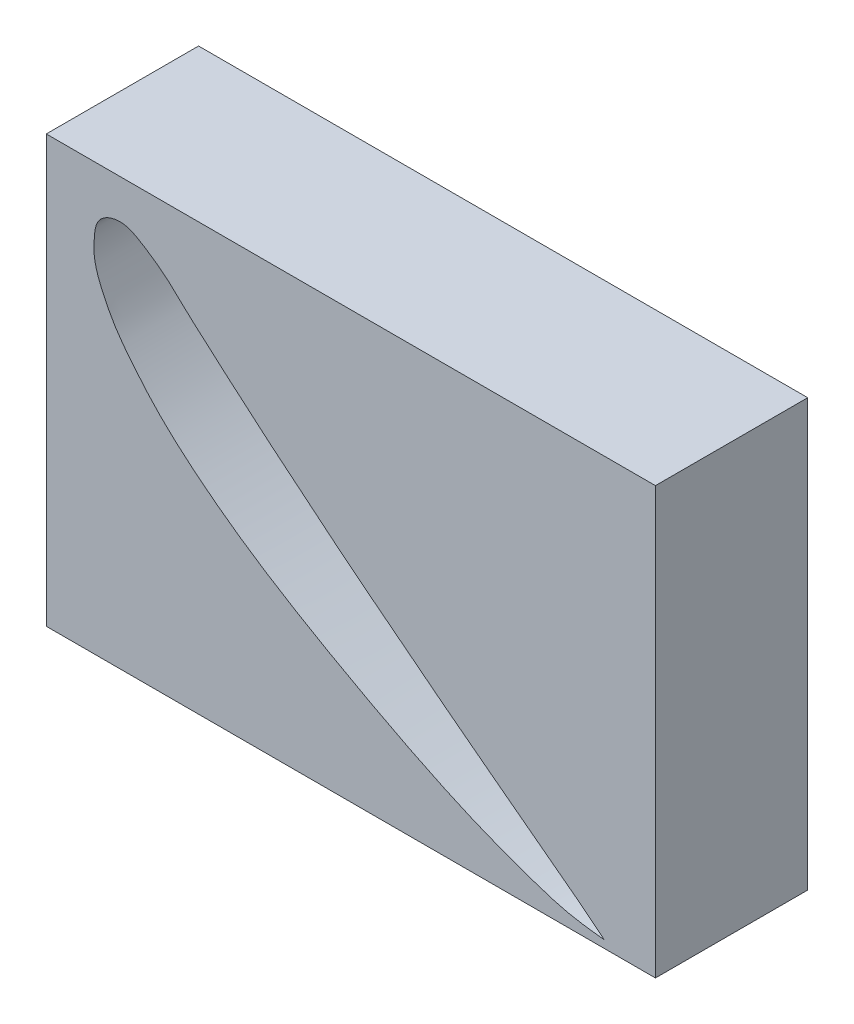
ISO-10303-21;
HEADER;
FILE_DESCRIPTION(('STEP AP214'),'2;1');
FILE_NAME('part.step','',(''),(''),'','','');
FILE_SCHEMA(('AUTOMOTIVE_DESIGN { 1 0 10303 214 1 1 1 1 }'));
ENDSEC;
DATA;
#1=APPLICATION_CONTEXT('core data for automotive mechanical design processes');
#2=APPLICATION_PROTOCOL_DEFINITION('international standard','automotive_design',2000,#1);
#3=PRODUCT_CONTEXT('',#1,'mechanical');
#4=PRODUCT('Part','Part','',(#3));
#5=PRODUCT_RELATED_PRODUCT_CATEGORY('part','',(#4));
#6=PRODUCT_DEFINITION_FORMATION('','',#4);
#7=PRODUCT_DEFINITION_CONTEXT('part definition',#1,'design');
#8=PRODUCT_DEFINITION('design','',#6,#7);
#9=PRODUCT_DEFINITION_SHAPE('','',#8);
#10=(LENGTH_UNIT() NAMED_UNIT(*) SI_UNIT(.MILLI.,.METRE.));
#11=(NAMED_UNIT(*) PLANE_ANGLE_UNIT() SI_UNIT($,.RADIAN.));
#12=(NAMED_UNIT(*) SI_UNIT($,.STERADIAN.) SOLID_ANGLE_UNIT());
#13=UNCERTAINTY_MEASURE_WITH_UNIT(LENGTH_MEASURE(1.E-05),#10,'distance_accuracy_value','');
#14=(GEOMETRIC_REPRESENTATION_CONTEXT(3) GLOBAL_UNCERTAINTY_ASSIGNED_CONTEXT((#13)) GLOBAL_UNIT_ASSIGNED_CONTEXT((#10,
#11,#12)) REPRESENTATION_CONTEXT('',''));
#15=CARTESIAN_POINT('',(0.,0.,0.));
#16=DIRECTION('',(0.,0.,1.));
#17=DIRECTION('',(1.,0.,0.));
#18=AXIS2_PLACEMENT_3D('',#15,#16,#17);
#19=CARTESIAN_POINT('',(-30.,30.,122.065556157337));
#20=DIRECTION('',(1.,0.,0.));
#21=DIRECTION('',(0.,1.,0.));
#22=AXIS2_PLACEMENT_3D('',#19,#20,#21);
#23=PLANE('',#22);
#24=DIRECTION('',(0.,-1.,0.));
#25=VECTOR('',#24,1.);
#26=CARTESIAN_POINT('',(-30.,30.,0.));
#27=LINE('',#26,#25);
#28=CARTESIAN_POINT('',(-30.,30.,0.));
#29=VERTEX_POINT('',#28);
#30=CARTESIAN_POINT('',(-30.,-40.,0.));
#31=VERTEX_POINT('',#30);
#32=EDGE_CURVE('E133',#29,#31,#27,.T.);
#33=ORIENTED_EDGE('',*,*,#32,.F.);
#34=DIRECTION('',(0.,0.,-1.));
#35=VECTOR('',#34,1.);
#36=CARTESIAN_POINT('',(-30.,30.,122.065556157337));
#37=LINE('',#36,#35);
#38=CARTESIAN_POINT('',(-30.,30.,-25.));
#39=VERTEX_POINT('',#38);
#40=EDGE_CURVE('E37',#29,#39,#37,.T.);
#41=ORIENTED_EDGE('',*,*,#40,.T.);
#42=DIRECTION('',(0.,-1.,0.));
#43=VECTOR('',#42,1.);
#44=CARTESIAN_POINT('',(-30.,30.,-25.));
#45=LINE('',#44,#43);
#46=CARTESIAN_POINT('',(-30.,-40.,-25.));
#47=VERTEX_POINT('',#46);
#48=EDGE_CURVE('E151',#39,#47,#45,.T.);
#49=ORIENTED_EDGE('',*,*,#48,.T.);
#50=DIRECTION('',(0.,0.,-1.));
#51=VECTOR('',#50,1.);
#52=CARTESIAN_POINT('',(-30.,-40.,122.065556157337));
#53=LINE('',#52,#51);
#54=EDGE_CURVE('E137',#31,#47,#53,.T.);
#55=ORIENTED_EDGE('',*,*,#54,.F.);
#56=EDGE_LOOP('',(#33,#41,#49,#55));
#57=FACE_BOUND('',#56,.T.);
#58=ADVANCED_FACE('F33',(#57),#23,.F.);
#59=CARTESIAN_POINT('',(-30.,-40.,122.065556157337));
#60=DIRECTION('',(0.,1.,0.));
#61=DIRECTION('',(0.,0.,1.));
#62=AXIS2_PLACEMENT_3D('',#59,#60,#61);
#63=PLANE('',#62);
#64=DIRECTION('',(1.,0.,0.));
#65=VECTOR('',#64,1.);
#66=CARTESIAN_POINT('',(-30.,-40.,0.));
#67=LINE('',#66,#65);
#68=CARTESIAN_POINT('',(70.,-40.,0.));
#69=VERTEX_POINT('',#68);
#70=EDGE_CURVE('E42',#31,#69,#67,.T.);
#71=ORIENTED_EDGE('',*,*,#70,.F.);
#72=ORIENTED_EDGE('',*,*,#54,.T.);
#73=DIRECTION('',(1.,0.,0.));
#74=VECTOR('',#73,1.);
#75=CARTESIAN_POINT('',(-30.,-40.,-25.));
#76=LINE('',#75,#74);
#77=CARTESIAN_POINT('',(70.,-40.,-25.));
#78=VERTEX_POINT('',#77);
#79=EDGE_CURVE('E150',#47,#78,#76,.T.);
#80=ORIENTED_EDGE('',*,*,#79,.T.);
#81=DIRECTION('',(0.,0.,-1.));
#82=VECTOR('',#81,1.);
#83=CARTESIAN_POINT('',(70.,-40.,122.065556157337));
#84=LINE('',#83,#82);
#85=EDGE_CURVE('E152',#69,#78,#84,.T.);
#86=ORIENTED_EDGE('',*,*,#85,.F.);
#87=EDGE_LOOP('',(#71,#72,#80,#86));
#88=FACE_BOUND('',#87,.T.);
#89=ADVANCED_FACE('F122',(#88),#63,.F.);
#90=CARTESIAN_POINT('',(70.,30.,122.065556157337));
#91=DIRECTION('',(-1.,0.,0.));
#92=DIRECTION('',(0.,-1.,0.));
#93=AXIS2_PLACEMENT_3D('',#90,#91,#92);
#94=PLANE('',#93);
#95=DIRECTION('',(0.,1.,0.));
#96=VECTOR('',#95,1.);
#97=CARTESIAN_POINT('',(70.,30.,0.));
#98=LINE('',#97,#96);
#99=CARTESIAN_POINT('',(70.,30.,0.));
#100=VERTEX_POINT('',#99);
#101=EDGE_CURVE('E11',#69,#100,#98,.T.);
#102=ORIENTED_EDGE('',*,*,#101,.F.);
#103=ORIENTED_EDGE('',*,*,#85,.T.);
#104=DIRECTION('',(0.,1.,0.));
#105=VECTOR('',#104,1.);
#106=CARTESIAN_POINT('',(70.,30.,-25.));
#107=LINE('',#106,#105);
#108=CARTESIAN_POINT('',(70.,30.,-25.));
#109=VERTEX_POINT('',#108);
#110=EDGE_CURVE('E153',#78,#109,#107,.T.);
#111=ORIENTED_EDGE('',*,*,#110,.T.);
#112=DIRECTION('',(0.,0.,-1.));
#113=VECTOR('',#112,1.);
#114=CARTESIAN_POINT('',(70.,30.,122.065556157337));
#115=LINE('',#114,#113);
#116=EDGE_CURVE('E145',#100,#109,#115,.T.);
#117=ORIENTED_EDGE('',*,*,#116,.F.);
#118=EDGE_LOOP('',(#102,#103,#111,#117));
#119=FACE_BOUND('',#118,.T.);
#120=ADVANCED_FACE('F118',(#119),#94,.F.);
#121=CARTESIAN_POINT('',(-30.,30.,122.065556157337));
#122=DIRECTION('',(0.,-1.,0.));
#123=DIRECTION('',(0.,0.,-1.));
#124=AXIS2_PLACEMENT_3D('',#121,#122,#123);
#125=PLANE('',#124);
#126=DIRECTION('',(-1.,0.,0.));
#127=VECTOR('',#126,1.);
#128=CARTESIAN_POINT('',(-30.,30.,0.));
#129=LINE('',#128,#127);
#130=EDGE_CURVE('E140',#100,#29,#129,.T.);
#131=ORIENTED_EDGE('',*,*,#130,.F.);
#132=ORIENTED_EDGE('',*,*,#116,.T.);
#133=DIRECTION('',(-1.,0.,0.));
#134=VECTOR('',#133,1.);
#135=CARTESIAN_POINT('',(-30.,30.,-25.));
#136=LINE('',#135,#134);
#137=EDGE_CURVE('E143',#109,#39,#136,.T.);
#138=ORIENTED_EDGE('',*,*,#137,.T.);
#139=ORIENTED_EDGE('',*,*,#40,.F.);
#140=EDGE_LOOP('',(#131,#132,#138,#139));
#141=FACE_BOUND('',#140,.T.);
#142=ADVANCED_FACE('F115',(#141),#125,.F.);
#143=CARTESIAN_POINT('',(0.,0.,-25.));
#144=DIRECTION('',(0.,0.,1.));
#145=DIRECTION('',(1.,0.,0.));
#146=AXIS2_PLACEMENT_3D('',#143,#144,#145);
#147=PLANE('',#146);
#148=DIRECTION('',(-0.778272578096171,0.627926583434353,0.));
#149=VECTOR('',#148,1.);
#150=CARTESIAN_POINT('',(57.6036750056897,-35.542429998651,-25.));
#151=LINE('',#150,#149);
#152=CARTESIAN_POINT('',(61.6010045224295,-38.7675590047992,-25.));
#153=VERTEX_POINT('',#152);
#154=CARTESIAN_POINT('',(57.6036750056897,-35.542429998651,-25.));
#155=VERTEX_POINT('',#154);
#156=EDGE_CURVE('E91',#153,#155,#151,.T.);
#157=ORIENTED_EDGE('',*,*,#156,.T.);
#158=CARTESIAN_POINT('',(57.6036750056897,-35.542429998651,-25.));
#159=CARTESIAN_POINT('',(56.2388977920127,-34.5074688290924,-25.));
#160=CARTESIAN_POINT('',(52.1445661509825,-31.4025853204187,-25.));
#161=CARTESIAN_POINT('',(45.3307585008602,-26.2147388286433,-25.));
#162=CARTESIAN_POINT('',(37.1067324226143,-20.0526071035048,-25.));
#163=CARTESIAN_POINT('',(29.0609366160996,-13.6617388149896,-25.));
#164=CARTESIAN_POINT('',(20.9169067344713,-7.39798040461272,-25.));
#165=CARTESIAN_POINT('',(12.9930323521428,-0.858716209414723,-25.));
#166=CARTESIAN_POINT('',(5.0582858099475,5.67038609166147,-25.));
#167=CARTESIAN_POINT('',(-1.37994875889341,11.3186071088783,-25.));
#168=CARTESIAN_POINT('',(-6.55409176600592,15.8203851997197,-25.));
#169=CARTESIAN_POINT('',(-9.57237805067181,18.8722758003235,-25.));
#170=CARTESIAN_POINT('',(-12.298789195959,20.976651583068,-25.));
#171=CARTESIAN_POINT('',(-14.4635519547526,22.3926177272927,-25.));
#172=CARTESIAN_POINT('',(-16.510186542221,23.5174604617983,-25.));
#173=CARTESIAN_POINT('',(-19.0350807988717,23.665473590377,-25.));
#174=CARTESIAN_POINT('',(-21.8604448995324,22.33963517474,-25.));
#175=CARTESIAN_POINT('',(-22.1349100172756,19.2815932305263,-25.));
#176=CARTESIAN_POINT('',(-22.2371773427754,16.5185153432735,-25.));
#177=CARTESIAN_POINT('',(-21.5273338612396,13.8353548334428,-25.));
#178=CARTESIAN_POINT('',(-20.2845397207269,11.1357407607872,-25.));
#179=CARTESIAN_POINT('',(-18.5798651776483,7.87909576155419,-25.));
#180=CARTESIAN_POINT('',(-15.8508439766193,4.35202984587507,-25.));
#181=CARTESIAN_POINT('',(-11.3474147710772,-0.934034012882321,-25.));
#182=CARTESIAN_POINT('',(-4.87029553469975,-6.64452599687584,-25.));
#183=CARTESIAN_POINT('',(3.4491751156533,-12.737304018546,-25.));
#184=CARTESIAN_POINT('',(12.2629555051353,-18.1725092001077,-25.));
#185=CARTESIAN_POINT('',(21.3285981876965,-23.2930852361814,-25.));
#186=CARTESIAN_POINT('',(30.6182219615916,-28.1713689973377,-25.));
#187=CARTESIAN_POINT('',(40.2405490728829,-32.7082606263667,-25.));
#188=CARTESIAN_POINT('',(48.6640657815466,-35.853082063981,-25.));
#189=CARTESIAN_POINT('',(55.790549096225,-38.1108965549288,-25.));
#190=CARTESIAN_POINT('',(59.6208137108184,-38.5437698429893,-25.));
#191=CARTESIAN_POINT('',(61.6010045224295,-38.7675590047992,-25.));
#192=B_SPLINE_CURVE_WITH_KNOTS('',3,(#158,#159,#160,#161,#162,#163,#164,#165,#166,#167,#168,
#169,#170,#171,#172,#173,#174,#175,#176,#177,#178,#179,#180,#181,#182,#183,#184,#185,#186,#187,
#188,#189,#190,#191),.UNSPECIFIED.,.F.,.F.,(4,1,1,1,1,1,1,1,1,1,1,1,1,1,1,1,1,1,1,1,1,1,1,1,1,1,
1,1,1,1,1,4),(0.,0.024539223239315,0.0736176697179449,0.122696116196575,0.171758102468826,
0.220820088741077,0.269879113320182,0.318936693489756,0.368025361597795,0.392583028094628,
0.417173001250673,0.429440472758663,0.441764658743505,0.454461371263475,0.461994015532278,
0.477712656864197,0.492780517083889,0.502278122505289,0.517831839222446,0.531656069899839,
0.544957030128068,0.57036121074101,0.595284183630096,0.644429948946362,0.693535769444944,
0.742943262592495,0.792666042354747,0.842690657547491,0.893260265870848,0.94491578158227,
0.971522264346957,1.),.UNSPECIFIED.);
#193=EDGE_CURVE('E50',#155,#153,#192,.T.);
#194=ORIENTED_EDGE('',*,*,#193,.T.);
#195=EDGE_LOOP('',(#157,#194));
#196=FACE_BOUND('',#195,.T.);
#197=ORIENTED_EDGE('',*,*,#48,.F.);
#198=ORIENTED_EDGE('',*,*,#137,.F.);
#199=ORIENTED_EDGE('',*,*,#110,.F.);
#200=ORIENTED_EDGE('',*,*,#79,.F.);
#201=EDGE_LOOP('',(#197,#198,#199,#200));
#202=FACE_BOUND('',#201,.T.);
#203=ADVANCED_FACE('F97',(#196,#202),#147,.F.);
#204=CARTESIAN_POINT('',(0.,0.,0.));
#205=DIRECTION('',(0.,0.,1.));
#206=DIRECTION('',(1.,0.,0.));
#207=AXIS2_PLACEMENT_3D('',#204,#205,#206);
#208=PLANE('',#207);
#209=CARTESIAN_POINT('',(57.6036750056897,-35.542429998651,0.));
#210=CARTESIAN_POINT('',(56.2388977920127,-34.5074688290924,0.));
#211=CARTESIAN_POINT('',(52.1445661509825,-31.4025853204187,0.));
#212=CARTESIAN_POINT('',(45.3307585008602,-26.2147388286433,0.));
#213=CARTESIAN_POINT('',(37.1067324226143,-20.0526071035048,0.));
#214=CARTESIAN_POINT('',(29.0609366160996,-13.6617388149896,0.));
#215=CARTESIAN_POINT('',(20.9169067344713,-7.39798040461272,0.));
#216=CARTESIAN_POINT('',(12.9930323521428,-0.858716209414723,0.));
#217=CARTESIAN_POINT('',(5.0582858099475,5.67038609166147,0.));
#218=CARTESIAN_POINT('',(-1.37994875889341,11.3186071088783,0.));
#219=CARTESIAN_POINT('',(-6.55409176600592,15.8203851997197,0.));
#220=CARTESIAN_POINT('',(-9.57237805067181,18.8722758003235,0.));
#221=CARTESIAN_POINT('',(-12.298789195959,20.976651583068,0.));
#222=CARTESIAN_POINT('',(-14.4635519547526,22.3926177272927,0.));
#223=CARTESIAN_POINT('',(-16.510186542221,23.5174604617983,0.));
#224=CARTESIAN_POINT('',(-19.0350807988717,23.665473590377,0.));
#225=CARTESIAN_POINT('',(-21.8604448995324,22.33963517474,0.));
#226=CARTESIAN_POINT('',(-22.1349100172756,19.2815932305263,0.));
#227=CARTESIAN_POINT('',(-22.2371773427754,16.5185153432735,0.));
#228=CARTESIAN_POINT('',(-21.5273338612396,13.8353548334428,0.));
#229=CARTESIAN_POINT('',(-20.2845397207269,11.1357407607872,0.));
#230=CARTESIAN_POINT('',(-18.5798651776483,7.87909576155419,0.));
#231=CARTESIAN_POINT('',(-15.8508439766193,4.35202984587507,0.));
#232=CARTESIAN_POINT('',(-11.3474147710772,-0.934034012882321,0.));
#233=CARTESIAN_POINT('',(-4.87029553469975,-6.64452599687584,0.));
#234=CARTESIAN_POINT('',(3.4491751156533,-12.737304018546,0.));
#235=CARTESIAN_POINT('',(12.2629555051353,-18.1725092001077,0.));
#236=CARTESIAN_POINT('',(21.3285981876965,-23.2930852361814,0.));
#237=CARTESIAN_POINT('',(30.6182219615916,-28.1713689973377,0.));
#238=CARTESIAN_POINT('',(40.2405490728829,-32.7082606263667,0.));
#239=CARTESIAN_POINT('',(48.6640657815466,-35.853082063981,0.));
#240=CARTESIAN_POINT('',(55.790549096225,-38.1108965549288,0.));
#241=CARTESIAN_POINT('',(59.6208137108184,-38.5437698429893,0.));
#242=CARTESIAN_POINT('',(61.6010045224295,-38.7675590047992,0.));
#243=B_SPLINE_CURVE_WITH_KNOTS('',3,(#209,#210,#211,#212,#213,#214,#215,#216,#217,#218,#219,
#220,#221,#222,#223,#224,#225,#226,#227,#228,#229,#230,#231,#232,#233,#234,#235,#236,#237,#238,
#239,#240,#241,#242),.UNSPECIFIED.,.F.,.F.,(4,1,1,1,1,1,1,1,1,1,1,1,1,1,1,1,1,1,1,1,1,1,1,1,1,1,
1,1,1,1,1,4),(0.,0.024539223239315,0.0736176697179449,0.122696116196575,0.171758102468826,
0.220820088741077,0.269879113320182,0.318936693489756,0.368025361597795,0.392583028094628,
0.417173001250673,0.429440472758663,0.441764658743505,0.454461371263475,0.461994015532278,
0.477712656864197,0.492780517083889,0.502278122505289,0.517831839222446,0.531656069899839,
0.544957030128068,0.57036121074101,0.595284183630096,0.644429948946362,0.693535769444944,
0.742943262592495,0.792666042354747,0.842690657547491,0.893260265870848,0.94491578158227,
0.971522264346957,1.),.UNSPECIFIED.);
#244=CARTESIAN_POINT('',(57.6036750056897,-35.542429998651,0.));
#245=VERTEX_POINT('',#244);
#246=CARTESIAN_POINT('',(61.6010045224295,-38.7675590047992,0.));
#247=VERTEX_POINT('',#246);
#248=EDGE_CURVE('E55',#245,#247,#243,.T.);
#249=ORIENTED_EDGE('',*,*,#248,.F.);
#250=DIRECTION('',(-0.778272578096171,0.627926583434353,0.));
#251=VECTOR('',#250,1.);
#252=CARTESIAN_POINT('',(57.6036750056897,-35.542429998651,0.));
#253=LINE('',#252,#251);
#254=EDGE_CURVE('E99',#247,#245,#253,.T.);
#255=ORIENTED_EDGE('',*,*,#254,.F.);
#256=EDGE_LOOP('',(#249,#255));
#257=FACE_BOUND('',#256,.T.);
#258=ORIENTED_EDGE('',*,*,#130,.T.);
#259=ORIENTED_EDGE('',*,*,#32,.T.);
#260=ORIENTED_EDGE('',*,*,#70,.T.);
#261=ORIENTED_EDGE('',*,*,#101,.T.);
#262=EDGE_LOOP('',(#258,#259,#260,#261));
#263=FACE_BOUND('',#262,.T.);
#264=ADVANCED_FACE('F35',(#257,#263),#208,.T.);
#265=DIRECTION('',(0.,0.,1.));
#266=VECTOR('',#265,1.);
#267=SURFACE_OF_LINEAR_EXTRUSION('',#192,#266);
#268=ORIENTED_EDGE('',*,*,#248,.T.);
#269=DIRECTION('',(0.,0.,1.));
#270=VECTOR('',#269,1.);
#271=CARTESIAN_POINT('',(61.6010045224295,-38.7675590047992,-25.));
#272=LINE('',#271,#270);
#273=EDGE_CURVE('E84',#153,#247,#272,.T.);
#274=ORIENTED_EDGE('',*,*,#273,.F.);
#275=ORIENTED_EDGE('',*,*,#193,.F.);
#276=DIRECTION('',(0.,0.,1.));
#277=VECTOR('',#276,1.);
#278=CARTESIAN_POINT('',(57.6036750056897,-35.542429998651,-25.));
#279=LINE('',#278,#277);
#280=EDGE_CURVE('E90',#155,#245,#279,.T.);
#281=ORIENTED_EDGE('',*,*,#280,.T.);
#282=EDGE_LOOP('',(#268,#274,#275,#281));
#283=FACE_BOUND('',#282,.T.);
#284=ADVANCED_FACE('F86',(#283),#267,.F.);
#285=CARTESIAN_POINT('',(57.6036750056897,-35.542429998651,-25.));
#286=DIRECTION('',(0.627926583434353,0.778272578096171,0.));
#287=DIRECTION('',(-0.778272578096171,0.627926583434353,0.));
#288=AXIS2_PLACEMENT_3D('',#285,#286,#287);
#289=PLANE('',#288);
#290=ORIENTED_EDGE('',*,*,#254,.T.);
#291=ORIENTED_EDGE('',*,*,#280,.F.);
#292=ORIENTED_EDGE('',*,*,#156,.F.);
#293=ORIENTED_EDGE('',*,*,#273,.T.);
#294=EDGE_LOOP('',(#290,#291,#292,#293));
#295=FACE_BOUND('',#294,.T.);
#296=ADVANCED_FACE('F94',(#295),#289,.F.);
#297=CLOSED_SHELL('',(#58,#89,#120,#142,#203,#264,#284,#296));
#298=MANIFOLD_SOLID_BREP('B2',#297);
#299=ADVANCED_BREP_SHAPE_REPRESENTATION('',(#18,#298),#14);
#300=SHAPE_DEFINITION_REPRESENTATION(#9,#299);
ENDSEC;
END-ISO-10303-21;
